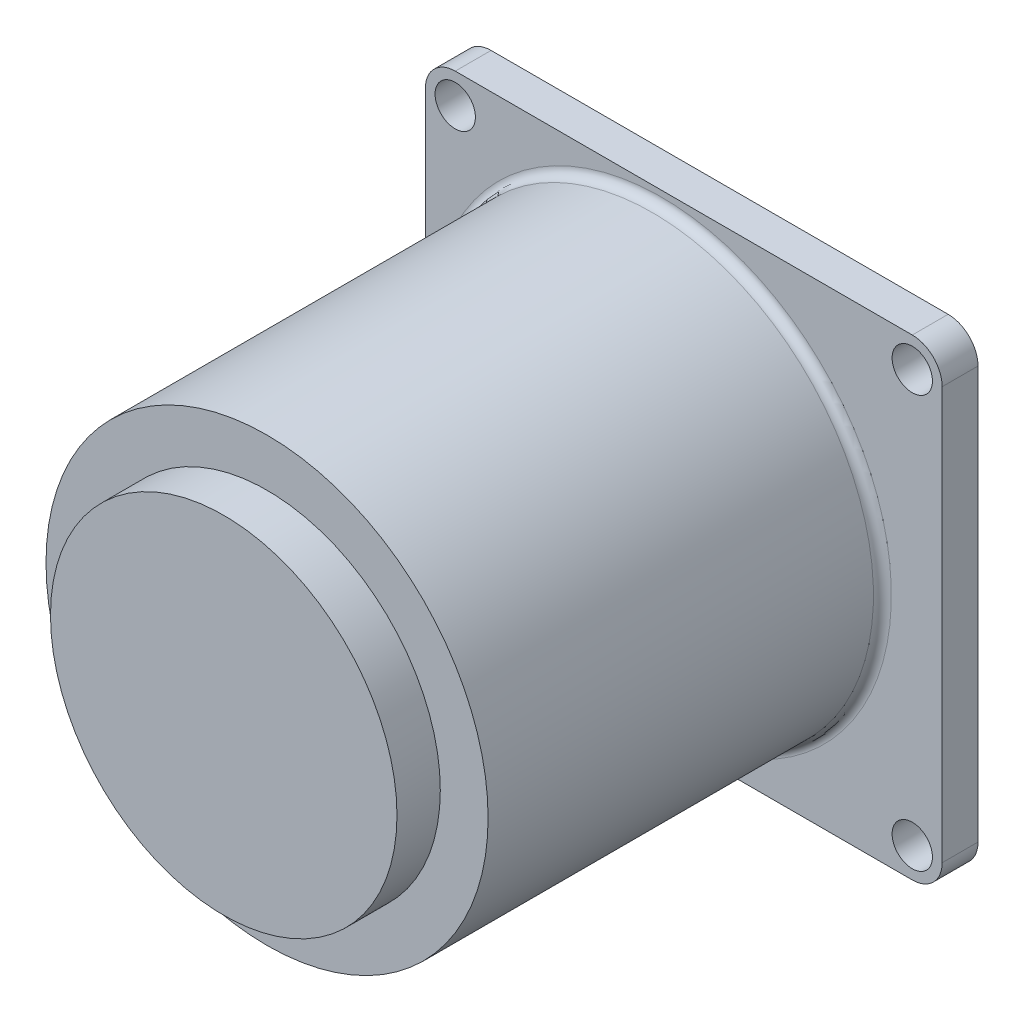
ISO-10303-21;
HEADER;
FILE_DESCRIPTION(('STEP AP214'),'2;1');
FILE_NAME('part.step','',(''),(''),'','','');
FILE_SCHEMA(('AUTOMOTIVE_DESIGN { 1 0 10303 214 1 1 1 1 }'));
ENDSEC;
DATA;
#1=APPLICATION_CONTEXT('core data for automotive mechanical design processes');
#2=APPLICATION_PROTOCOL_DEFINITION('international standard','automotive_design',2000,#1);
#3=PRODUCT_CONTEXT('',#1,'mechanical');
#4=PRODUCT('Part','Part','',(#3));
#5=PRODUCT_RELATED_PRODUCT_CATEGORY('part','',(#4));
#6=PRODUCT_DEFINITION_FORMATION('','',#4);
#7=PRODUCT_DEFINITION_CONTEXT('part definition',#1,'design');
#8=PRODUCT_DEFINITION('design','',#6,#7);
#9=PRODUCT_DEFINITION_SHAPE('','',#8);
#10=(LENGTH_UNIT() NAMED_UNIT(*) SI_UNIT(.MILLI.,.METRE.));
#11=(NAMED_UNIT(*) PLANE_ANGLE_UNIT() SI_UNIT($,.RADIAN.));
#12=(NAMED_UNIT(*) SI_UNIT($,.STERADIAN.) SOLID_ANGLE_UNIT());
#13=UNCERTAINTY_MEASURE_WITH_UNIT(LENGTH_MEASURE(1.E-05),#10,'distance_accuracy_value','');
#14=(GEOMETRIC_REPRESENTATION_CONTEXT(3) GLOBAL_UNCERTAINTY_ASSIGNED_CONTEXT((#13)) GLOBAL_UNIT_ASSIGNED_CONTEXT((#10,
#11,#12)) REPRESENTATION_CONTEXT('',''));
#15=CARTESIAN_POINT('',(0.,0.,0.));
#16=DIRECTION('',(0.,0.,1.));
#17=DIRECTION('',(1.,0.,0.));
#18=AXIS2_PLACEMENT_3D('',#15,#16,#17);
#19=CARTESIAN_POINT('',(0.,0.,24.));
#20=DIRECTION('',(1.,0.,0.));
#21=DIRECTION('',(0.,0.,-1.));
#22=AXIS2_PLACEMENT_3D('',#19,#20,#21);
#23=PLANE('',#22);
#24=DIRECTION('',(0.,-1.,0.));
#25=VECTOR('',#24,1.);
#26=CARTESIAN_POINT('',(0.,0.,0.));
#27=LINE('',#26,#25);
#28=CARTESIAN_POINT('',(0.,296.,0.));
#29=VERTEX_POINT('',#28);
#30=CARTESIAN_POINT('',(0.,20.,0.));
#31=VERTEX_POINT('',#30);
#32=EDGE_CURVE('E135',#29,#31,#27,.T.);
#33=ORIENTED_EDGE('',*,*,#32,.T.);
#34=DIRECTION('',(0.,0.,-1.));
#35=VECTOR('',#34,1.);
#36=CARTESIAN_POINT('',(0.,20.,24.));
#37=LINE('',#36,#35);
#38=CARTESIAN_POINT('',(0.,20.,24.));
#39=VERTEX_POINT('',#38);
#40=EDGE_CURVE('E113',#31,#39,#37,.F.);
#41=ORIENTED_EDGE('',*,*,#40,.T.);
#42=DIRECTION('',(0.,-1.,0.));
#43=VECTOR('',#42,1.);
#44=CARTESIAN_POINT('',(0.,0.,24.));
#45=LINE('',#44,#43);
#46=CARTESIAN_POINT('',(0.,296.,24.));
#47=VERTEX_POINT('',#46);
#48=EDGE_CURVE('E145',#47,#39,#45,.T.);
#49=ORIENTED_EDGE('',*,*,#48,.F.);
#50=DIRECTION('',(0.,0.,-1.));
#51=VECTOR('',#50,1.);
#52=CARTESIAN_POINT('',(0.,296.,24.));
#53=LINE('',#52,#51);
#54=EDGE_CURVE('E118',#47,#29,#53,.T.);
#55=ORIENTED_EDGE('',*,*,#54,.T.);
#56=EDGE_LOOP('',(#33,#41,#49,#55));
#57=FACE_BOUND('',#56,.T.);
#58=ADVANCED_FACE('F41',(#57),#23,.F.);
#59=CARTESIAN_POINT('',(0.,0.,24.));
#60=DIRECTION('',(0.,1.,0.));
#61=DIRECTION('',(0.,0.,1.));
#62=AXIS2_PLACEMENT_3D('',#59,#60,#61);
#63=PLANE('',#62);
#64=DIRECTION('',(1.,0.,0.));
#65=VECTOR('',#64,1.);
#66=CARTESIAN_POINT('',(0.,0.,24.));
#67=LINE('',#66,#65);
#68=CARTESIAN_POINT('',(20.,0.,24.));
#69=VERTEX_POINT('',#68);
#70=CARTESIAN_POINT('',(326.,0.,24.));
#71=VERTEX_POINT('',#70);
#72=EDGE_CURVE('E128',#69,#71,#67,.T.);
#73=ORIENTED_EDGE('',*,*,#72,.F.);
#74=DIRECTION('',(0.,0.,-1.));
#75=VECTOR('',#74,1.);
#76=CARTESIAN_POINT('',(20.,0.,24.));
#77=LINE('',#76,#75);
#78=CARTESIAN_POINT('',(20.,0.,0.));
#79=VERTEX_POINT('',#78);
#80=EDGE_CURVE('E112',#69,#79,#77,.T.);
#81=ORIENTED_EDGE('',*,*,#80,.T.);
#82=DIRECTION('',(1.,0.,0.));
#83=VECTOR('',#82,1.);
#84=CARTESIAN_POINT('',(0.,0.,0.));
#85=LINE('',#84,#83);
#86=CARTESIAN_POINT('',(326.,0.,0.));
#87=VERTEX_POINT('',#86);
#88=EDGE_CURVE('E125',#79,#87,#85,.T.);
#89=ORIENTED_EDGE('',*,*,#88,.T.);
#90=DIRECTION('',(0.,0.,-1.));
#91=VECTOR('',#90,1.);
#92=CARTESIAN_POINT('',(326.,0.,24.));
#93=LINE('',#92,#91);
#94=EDGE_CURVE('E130',#87,#71,#93,.F.);
#95=ORIENTED_EDGE('',*,*,#94,.T.);
#96=EDGE_LOOP('',(#73,#81,#89,#95));
#97=FACE_BOUND('',#96,.T.);
#98=ADVANCED_FACE('F124',(#97),#63,.F.);
#99=CARTESIAN_POINT('',(346.,0.,24.));
#100=DIRECTION('',(-1.,0.,0.));
#101=DIRECTION('',(0.,0.,1.));
#102=AXIS2_PLACEMENT_3D('',#99,#100,#101);
#103=PLANE('',#102);
#104=DIRECTION('',(0.,1.,0.));
#105=VECTOR('',#104,1.);
#106=CARTESIAN_POINT('',(346.,0.,0.));
#107=LINE('',#106,#105);
#108=CARTESIAN_POINT('',(346.,20.,0.));
#109=VERTEX_POINT('',#108);
#110=CARTESIAN_POINT('',(346.,296.,0.));
#111=VERTEX_POINT('',#110);
#112=EDGE_CURVE('E134',#109,#111,#107,.T.);
#113=ORIENTED_EDGE('',*,*,#112,.T.);
#114=DIRECTION('',(0.,0.,-1.));
#115=VECTOR('',#114,1.);
#116=CARTESIAN_POINT('',(346.,296.,24.));
#117=LINE('',#116,#115);
#118=CARTESIAN_POINT('',(346.,296.,24.));
#119=VERTEX_POINT('',#118);
#120=EDGE_CURVE('E169',#111,#119,#117,.F.);
#121=ORIENTED_EDGE('',*,*,#120,.T.);
#122=DIRECTION('',(0.,1.,0.));
#123=VECTOR('',#122,1.);
#124=CARTESIAN_POINT('',(346.,0.,24.));
#125=LINE('',#124,#123);
#126=CARTESIAN_POINT('',(346.,20.,24.));
#127=VERTEX_POINT('',#126);
#128=EDGE_CURVE('E187',#127,#119,#125,.T.);
#129=ORIENTED_EDGE('',*,*,#128,.F.);
#130=DIRECTION('',(0.,0.,-1.));
#131=VECTOR('',#130,1.);
#132=CARTESIAN_POINT('',(346.,20.,24.));
#133=LINE('',#132,#131);
#134=EDGE_CURVE('E166',#127,#109,#133,.T.);
#135=ORIENTED_EDGE('',*,*,#134,.T.);
#136=EDGE_LOOP('',(#113,#121,#129,#135));
#137=FACE_BOUND('',#136,.T.);
#138=ADVANCED_FACE('F202',(#137),#103,.F.);
#139=CARTESIAN_POINT('',(0.,316.,24.));
#140=DIRECTION('',(0.,-1.,0.));
#141=DIRECTION('',(0.,0.,-1.));
#142=AXIS2_PLACEMENT_3D('',#139,#140,#141);
#143=PLANE('',#142);
#144=DIRECTION('',(-1.,0.,0.));
#145=VECTOR('',#144,1.);
#146=CARTESIAN_POINT('',(0.,316.,0.));
#147=LINE('',#146,#145);
#148=CARTESIAN_POINT('',(326.,316.,0.));
#149=VERTEX_POINT('',#148);
#150=CARTESIAN_POINT('',(20.,316.,0.));
#151=VERTEX_POINT('',#150);
#152=EDGE_CURVE('E138',#149,#151,#147,.T.);
#153=ORIENTED_EDGE('',*,*,#152,.T.);
#154=DIRECTION('',(0.,0.,-1.));
#155=VECTOR('',#154,1.);
#156=CARTESIAN_POINT('',(20.,316.,24.));
#157=LINE('',#156,#155);
#158=CARTESIAN_POINT('',(20.,316.,24.));
#159=VERTEX_POINT('',#158);
#160=EDGE_CURVE('E56',#151,#159,#157,.F.);
#161=ORIENTED_EDGE('',*,*,#160,.T.);
#162=DIRECTION('',(-1.,0.,0.));
#163=VECTOR('',#162,1.);
#164=CARTESIAN_POINT('',(0.,316.,24.));
#165=LINE('',#164,#163);
#166=CARTESIAN_POINT('',(326.,316.,24.));
#167=VERTEX_POINT('',#166);
#168=EDGE_CURVE('E146',#167,#159,#165,.T.);
#169=ORIENTED_EDGE('',*,*,#168,.F.);
#170=DIRECTION('',(0.,0.,-1.));
#171=VECTOR('',#170,1.);
#172=CARTESIAN_POINT('',(326.,316.,24.));
#173=LINE('',#172,#171);
#174=EDGE_CURVE('E162',#167,#149,#173,.T.);
#175=ORIENTED_EDGE('',*,*,#174,.T.);
#176=EDGE_LOOP('',(#153,#161,#169,#175));
#177=FACE_BOUND('',#176,.T.);
#178=ADVANCED_FACE('F197',(#177),#143,.F.);
#179=CARTESIAN_POINT('',(0.,0.,24.));
#180=DIRECTION('',(0.,0.,-1.));
#181=DIRECTION('',(-1.,0.,0.));
#182=AXIS2_PLACEMENT_3D('',#179,#180,#181);
#183=PLANE('',#182);
#184=CARTESIAN_POINT('',(158.,158.,24.));
#185=DIRECTION('',(0.,0.,-1.));
#186=DIRECTION('',(-1.,0.,0.));
#187=AXIS2_PLACEMENT_3D('',#184,#185,#186);
#188=CIRCLE('',#187,154.);
#189=CARTESIAN_POINT('',(3.99999999999998,158.,24.));
#190=VERTEX_POINT('',#189);
#191=EDGE_CURVE('E11',#190,#190,#188,.T.);
#192=ORIENTED_EDGE('',*,*,#191,.T.);
#193=EDGE_LOOP('',(#192));
#194=FACE_BOUND('',#193,.T.);
#195=CARTESIAN_POINT('',(326.,20.,24.));
#196=DIRECTION('',(0.,0.,-1.));
#197=DIRECTION('',(-1.,0.,0.));
#198=AXIS2_PLACEMENT_3D('',#195,#196,#197);
#199=CIRCLE('',#198,13.5000000000001);
#200=CARTESIAN_POINT('',(312.5,20.,24.));
#201=VERTEX_POINT('',#200);
#202=EDGE_CURVE('E338',#201,#201,#199,.F.);
#203=ORIENTED_EDGE('',*,*,#202,.F.);
#204=EDGE_LOOP('',(#203));
#205=FACE_BOUND('',#204,.T.);
#206=CARTESIAN_POINT('',(20.,20.,24.));
#207=DIRECTION('',(0.,0.,-1.));
#208=DIRECTION('',(-1.,0.,0.));
#209=AXIS2_PLACEMENT_3D('',#206,#207,#208);
#210=CIRCLE('',#209,13.5);
#211=CARTESIAN_POINT('',(6.50000000000001,20.,24.));
#212=VERTEX_POINT('',#211);
#213=EDGE_CURVE('E342',#212,#212,#210,.F.);
#214=ORIENTED_EDGE('',*,*,#213,.F.);
#215=EDGE_LOOP('',(#214));
#216=FACE_BOUND('',#215,.T.);
#217=CARTESIAN_POINT('',(20.,296.,24.));
#218=DIRECTION('',(0.,0.,-1.));
#219=DIRECTION('',(-1.,0.,0.));
#220=AXIS2_PLACEMENT_3D('',#217,#218,#219);
#221=CIRCLE('',#220,13.5);
#222=CARTESIAN_POINT('',(6.50000000000001,296.,24.));
#223=VERTEX_POINT('',#222);
#224=EDGE_CURVE('E346',#223,#223,#221,.F.);
#225=ORIENTED_EDGE('',*,*,#224,.F.);
#226=EDGE_LOOP('',(#225));
#227=FACE_BOUND('',#226,.T.);
#228=CARTESIAN_POINT('',(326.,296.,24.));
#229=DIRECTION('',(0.,0.,-1.));
#230=DIRECTION('',(-1.,0.,0.));
#231=AXIS2_PLACEMENT_3D('',#228,#229,#230);
#232=CIRCLE('',#231,13.5);
#233=CARTESIAN_POINT('',(312.5,296.,24.));
#234=VERTEX_POINT('',#233);
#235=EDGE_CURVE('E349',#234,#234,#232,.F.);
#236=ORIENTED_EDGE('',*,*,#235,.F.);
#237=EDGE_LOOP('',(#236));
#238=FACE_BOUND('',#237,.T.);
#239=ORIENTED_EDGE('',*,*,#48,.T.);
#240=CARTESIAN_POINT('',(20.,20.,24.));
#241=DIRECTION('',(0.,0.,-1.));
#242=DIRECTION('',(-1.,0.,0.));
#243=AXIS2_PLACEMENT_3D('',#240,#241,#242);
#244=CIRCLE('',#243,20.);
#245=EDGE_CURVE('E160',#39,#69,#244,.F.);
#246=ORIENTED_EDGE('',*,*,#245,.T.);
#247=ORIENTED_EDGE('',*,*,#72,.T.);
#248=CARTESIAN_POINT('',(326.,20.,24.));
#249=DIRECTION('',(0.,0.,-1.));
#250=DIRECTION('',(-1.,0.,0.));
#251=AXIS2_PLACEMENT_3D('',#248,#249,#250);
#252=CIRCLE('',#251,20.);
#253=EDGE_CURVE('E155',#71,#127,#252,.F.);
#254=ORIENTED_EDGE('',*,*,#253,.T.);
#255=ORIENTED_EDGE('',*,*,#128,.T.);
#256=CARTESIAN_POINT('',(326.,296.,24.));
#257=DIRECTION('',(0.,0.,-1.));
#258=DIRECTION('',(-1.,0.,0.));
#259=AXIS2_PLACEMENT_3D('',#256,#257,#258);
#260=CIRCLE('',#259,20.);
#261=EDGE_CURVE('E63',#119,#167,#260,.F.);
#262=ORIENTED_EDGE('',*,*,#261,.T.);
#263=ORIENTED_EDGE('',*,*,#168,.T.);
#264=CARTESIAN_POINT('',(20.,296.,24.));
#265=DIRECTION('',(0.,0.,-1.));
#266=DIRECTION('',(-1.,0.,0.));
#267=AXIS2_PLACEMENT_3D('',#264,#265,#266);
#268=CIRCLE('',#267,20.);
#269=EDGE_CURVE('E158',#159,#47,#268,.F.);
#270=ORIENTED_EDGE('',*,*,#269,.T.);
#271=EDGE_LOOP('',(#239,#246,#247,#254,#255,#262,#263,#270));
#272=FACE_BOUND('',#271,.T.);
#273=ADVANCED_FACE('F189',(#194,#205,#216,#227,#238,#272),#183,.F.);
#274=CARTESIAN_POINT('',(0.,0.,0.));
#275=DIRECTION('',(0.,0.,-1.));
#276=DIRECTION('',(-1.,0.,0.));
#277=AXIS2_PLACEMENT_3D('',#274,#275,#276);
#278=PLANE('',#277);
#279=CARTESIAN_POINT('',(326.,20.,0.));
#280=DIRECTION('',(0.,0.,-1.));
#281=DIRECTION('',(1.,0.,0.));
#282=AXIS2_PLACEMENT_3D('',#279,#280,#281);
#283=CIRCLE('',#282,13.5000000000001);
#284=CARTESIAN_POINT('',(339.5,20.,0.));
#285=VERTEX_POINT('',#284);
#286=EDGE_CURVE('E356',#285,#285,#283,.T.);
#287=ORIENTED_EDGE('',*,*,#286,.F.);
#288=EDGE_LOOP('',(#287));
#289=FACE_BOUND('',#288,.T.);
#290=CARTESIAN_POINT('',(20.,20.,0.));
#291=DIRECTION('',(0.,0.,-1.));
#292=DIRECTION('',(-1.,0.,0.));
#293=AXIS2_PLACEMENT_3D('',#290,#291,#292);
#294=CIRCLE('',#293,13.5);
#295=CARTESIAN_POINT('',(6.50000000000001,20.,0.));
#296=VERTEX_POINT('',#295);
#297=EDGE_CURVE('E360',#296,#296,#294,.T.);
#298=ORIENTED_EDGE('',*,*,#297,.F.);
#299=EDGE_LOOP('',(#298));
#300=FACE_BOUND('',#299,.T.);
#301=CARTESIAN_POINT('',(20.,296.,0.));
#302=DIRECTION('',(0.,0.,-1.));
#303=DIRECTION('',(1.,0.,0.));
#304=AXIS2_PLACEMENT_3D('',#301,#302,#303);
#305=CIRCLE('',#304,13.5);
#306=CARTESIAN_POINT('',(33.5,296.,0.));
#307=VERTEX_POINT('',#306);
#308=EDGE_CURVE('E353',#307,#307,#305,.T.);
#309=ORIENTED_EDGE('',*,*,#308,.F.);
#310=EDGE_LOOP('',(#309));
#311=FACE_BOUND('',#310,.T.);
#312=CARTESIAN_POINT('',(326.,296.,0.));
#313=DIRECTION('',(0.,0.,-1.));
#314=DIRECTION('',(-1.,0.,0.));
#315=AXIS2_PLACEMENT_3D('',#312,#313,#314);
#316=CIRCLE('',#315,13.5);
#317=CARTESIAN_POINT('',(312.5,296.,0.));
#318=VERTEX_POINT('',#317);
#319=EDGE_CURVE('E350',#318,#318,#316,.T.);
#320=ORIENTED_EDGE('',*,*,#319,.F.);
#321=EDGE_LOOP('',(#320));
#322=FACE_BOUND('',#321,.T.);
#323=ORIENTED_EDGE('',*,*,#88,.F.);
#324=CARTESIAN_POINT('',(20.,20.,0.));
#325=DIRECTION('',(0.,0.,-1.));
#326=DIRECTION('',(-1.,0.,0.));
#327=AXIS2_PLACEMENT_3D('',#324,#325,#326);
#328=CIRCLE('',#327,20.);
#329=EDGE_CURVE('E108',#79,#31,#328,.T.);
#330=ORIENTED_EDGE('',*,*,#329,.T.);
#331=ORIENTED_EDGE('',*,*,#32,.F.);
#332=CARTESIAN_POINT('',(20.,296.,0.));
#333=DIRECTION('',(0.,0.,-1.));
#334=DIRECTION('',(-1.,0.,0.));
#335=AXIS2_PLACEMENT_3D('',#332,#333,#334);
#336=CIRCLE('',#335,20.);
#337=EDGE_CURVE('E119',#29,#151,#336,.T.);
#338=ORIENTED_EDGE('',*,*,#337,.T.);
#339=ORIENTED_EDGE('',*,*,#152,.F.);
#340=CARTESIAN_POINT('',(326.,296.,0.));
#341=DIRECTION('',(0.,0.,-1.));
#342=DIRECTION('',(-1.,0.,0.));
#343=AXIS2_PLACEMENT_3D('',#340,#341,#342);
#344=CIRCLE('',#343,20.);
#345=EDGE_CURVE('E149',#149,#111,#344,.T.);
#346=ORIENTED_EDGE('',*,*,#345,.T.);
#347=ORIENTED_EDGE('',*,*,#112,.F.);
#348=CARTESIAN_POINT('',(326.,20.,0.));
#349=DIRECTION('',(0.,0.,-1.));
#350=DIRECTION('',(-1.,0.,0.));
#351=AXIS2_PLACEMENT_3D('',#348,#349,#350);
#352=CIRCLE('',#351,20.);
#353=EDGE_CURVE('E129',#109,#87,#352,.T.);
#354=ORIENTED_EDGE('',*,*,#353,.T.);
#355=EDGE_LOOP('',(#323,#330,#331,#338,#339,#346,#347,#354));
#356=FACE_BOUND('',#355,.T.);
#357=ADVANCED_FACE('F132',(#289,#300,#311,#322,#356),#278,.T.);
#358=CARTESIAN_POINT('',(20.,20.,24.));
#359=DIRECTION('',(0.,0.,-1.));
#360=DIRECTION('',(-1.,0.,0.));
#361=AXIS2_PLACEMENT_3D('',#358,#359,#360);
#362=CYLINDRICAL_SURFACE('',#361,20.);
#363=ORIENTED_EDGE('',*,*,#245,.F.);
#364=ORIENTED_EDGE('',*,*,#40,.F.);
#365=ORIENTED_EDGE('',*,*,#329,.F.);
#366=ORIENTED_EDGE('',*,*,#80,.F.);
#367=EDGE_LOOP('',(#363,#364,#365,#366));
#368=FACE_BOUND('',#367,.T.);
#369=ADVANCED_FACE('F111',(#368),#362,.T.);
#370=CARTESIAN_POINT('',(20.,296.,24.));
#371=DIRECTION('',(0.,0.,-1.));
#372=DIRECTION('',(-1.,0.,0.));
#373=AXIS2_PLACEMENT_3D('',#370,#371,#372);
#374=CYLINDRICAL_SURFACE('',#373,20.);
#375=ORIENTED_EDGE('',*,*,#269,.F.);
#376=ORIENTED_EDGE('',*,*,#160,.F.);
#377=ORIENTED_EDGE('',*,*,#337,.F.);
#378=ORIENTED_EDGE('',*,*,#54,.F.);
#379=EDGE_LOOP('',(#375,#376,#377,#378));
#380=FACE_BOUND('',#379,.T.);
#381=ADVANCED_FACE('F194',(#380),#374,.T.);
#382=CARTESIAN_POINT('',(326.,296.,24.));
#383=DIRECTION('',(0.,0.,-1.));
#384=DIRECTION('',(-1.,0.,0.));
#385=AXIS2_PLACEMENT_3D('',#382,#383,#384);
#386=CYLINDRICAL_SURFACE('',#385,20.);
#387=ORIENTED_EDGE('',*,*,#261,.F.);
#388=ORIENTED_EDGE('',*,*,#120,.F.);
#389=ORIENTED_EDGE('',*,*,#345,.F.);
#390=ORIENTED_EDGE('',*,*,#174,.F.);
#391=EDGE_LOOP('',(#387,#388,#389,#390));
#392=FACE_BOUND('',#391,.T.);
#393=ADVANCED_FACE('F199',(#392),#386,.T.);
#394=CARTESIAN_POINT('',(326.,20.,24.));
#395=DIRECTION('',(0.,0.,-1.));
#396=DIRECTION('',(-1.,0.,0.));
#397=AXIS2_PLACEMENT_3D('',#394,#395,#396);
#398=CYLINDRICAL_SURFACE('',#397,20.);
#399=ORIENTED_EDGE('',*,*,#253,.F.);
#400=ORIENTED_EDGE('',*,*,#94,.F.);
#401=ORIENTED_EDGE('',*,*,#353,.F.);
#402=ORIENTED_EDGE('',*,*,#134,.F.);
#403=EDGE_LOOP('',(#399,#400,#401,#402));
#404=FACE_BOUND('',#403,.T.);
#405=ADVANCED_FACE('F207',(#404),#398,.T.);
#406=CARTESIAN_POINT('',(158.,158.,288.));
#407=DIRECTION('',(0.,0.,-1.));
#408=DIRECTION('',(-1.,0.,0.));
#409=AXIS2_PLACEMENT_3D('',#406,#407,#408);
#410=CYLINDRICAL_SURFACE('',#409,148.);
#411=CARTESIAN_POINT('',(158.,158.,30.));
#412=DIRECTION('',(0.,0.,-1.));
#413=DIRECTION('',(-1.,0.,0.));
#414=AXIS2_PLACEMENT_3D('',#411,#412,#413);
#415=CIRCLE('',#414,148.);
#416=CARTESIAN_POINT('',(9.99999999999998,158.,30.));
#417=VERTEX_POINT('',#416);
#418=EDGE_CURVE('E49',#417,#417,#415,.F.);
#419=ORIENTED_EDGE('',*,*,#418,.T.);
#420=EDGE_LOOP('',(#419));
#421=FACE_BOUND('',#420,.T.);
#422=CARTESIAN_POINT('',(158.,158.,288.));
#423=DIRECTION('',(0.,0.,1.));
#424=DIRECTION('',(1.,0.,0.));
#425=AXIS2_PLACEMENT_3D('',#422,#423,#424);
#426=CIRCLE('',#425,148.);
#427=CARTESIAN_POINT('',(306.,158.,288.));
#428=VERTEX_POINT('',#427);
#429=EDGE_CURVE('E140',#428,#428,#426,.T.);
#430=ORIENTED_EDGE('',*,*,#429,.F.);
#431=EDGE_LOOP('',(#430));
#432=FACE_BOUND('',#431,.T.);
#433=ADVANCED_FACE('F209',(#421,#432),#410,.T.);
#434=CARTESIAN_POINT('',(158.,158.,288.));
#435=DIRECTION('',(0.,0.,1.));
#436=DIRECTION('',(1.,0.,0.));
#437=AXIS2_PLACEMENT_3D('',#434,#435,#436);
#438=PLANE('',#437);
#439=CARTESIAN_POINT('',(158.,158.,288.));
#440=DIRECTION('',(0.,0.,1.));
#441=DIRECTION('',(1.,0.,0.));
#442=AXIS2_PLACEMENT_3D('',#439,#440,#441);
#443=CIRCLE('',#442,116.);
#444=CARTESIAN_POINT('',(42.,158.,288.));
#445=VERTEX_POINT('',#444);
#446=EDGE_CURVE('E170',#445,#445,#443,.T.);
#447=ORIENTED_EDGE('',*,*,#446,.F.);
#448=EDGE_LOOP('',(#447));
#449=FACE_BOUND('',#448,.T.);
#450=ORIENTED_EDGE('',*,*,#429,.T.);
#451=EDGE_LOOP('',(#450));
#452=FACE_BOUND('',#451,.T.);
#453=ADVANCED_FACE('F214',(#449,#452),#438,.T.);
#454=CARTESIAN_POINT('',(158.,158.,317.));
#455=DIRECTION('',(0.,0.,-1.));
#456=DIRECTION('',(-1.,0.,0.));
#457=AXIS2_PLACEMENT_3D('',#454,#455,#456);
#458=CYLINDRICAL_SURFACE('',#457,116.);
#459=CARTESIAN_POINT('',(158.,158.,317.));
#460=DIRECTION('',(0.,0.,1.));
#461=DIRECTION('',(1.,0.,0.));
#462=AXIS2_PLACEMENT_3D('',#459,#460,#461);
#463=CIRCLE('',#462,116.);
#464=CARTESIAN_POINT('',(42.,158.,317.));
#465=VERTEX_POINT('',#464);
#466=EDGE_CURVE('E180',#465,#465,#463,.T.);
#467=CARTESIAN_POINT('',(42.,158.,317.));
#468=CARTESIAN_POINT('',(42.,158.,316.697916666667));
#469=CARTESIAN_POINT('',(42.,158.,316.395833333333));
#470=CARTESIAN_POINT('',(42.,158.,315.791666666667));
#471=CARTESIAN_POINT('',(42.,158.,315.489583333333));
#472=CARTESIAN_POINT('',(42.,158.,314.885416666667));
#473=CARTESIAN_POINT('',(42.,158.,314.583333333333));
#474=CARTESIAN_POINT('',(42.,158.,313.979166666667));
#475=CARTESIAN_POINT('',(42.,158.,313.677083333333));
#476=CARTESIAN_POINT('',(42.,158.,313.072916666667));
#477=CARTESIAN_POINT('',(42.,158.,312.770833333333));
#478=CARTESIAN_POINT('',(42.,158.,312.166666666667));
#479=CARTESIAN_POINT('',(42.,158.,311.864583333333));
#480=CARTESIAN_POINT('',(42.,158.,311.260416666667));
#481=CARTESIAN_POINT('',(42.,158.,310.958333333333));
#482=CARTESIAN_POINT('',(42.,158.,310.354166666667));
#483=CARTESIAN_POINT('',(42.,158.,310.052083333333));
#484=CARTESIAN_POINT('',(42.,158.,309.447916666667));
#485=CARTESIAN_POINT('',(42.,158.,309.145833333333));
#486=CARTESIAN_POINT('',(42.,158.,308.541666666667));
#487=CARTESIAN_POINT('',(42.,158.,308.239583333333));
#488=CARTESIAN_POINT('',(42.,158.,307.635416666667));
#489=CARTESIAN_POINT('',(42.,158.,307.333333333333));
#490=CARTESIAN_POINT('',(42.,158.,306.729166666667));
#491=CARTESIAN_POINT('',(42.,158.,306.427083333333));
#492=CARTESIAN_POINT('',(42.,158.,305.822916666667));
#493=CARTESIAN_POINT('',(42.,158.,305.520833333333));
#494=CARTESIAN_POINT('',(42.,158.,304.916666666667));
#495=CARTESIAN_POINT('',(42.,158.,304.614583333333));
#496=CARTESIAN_POINT('',(42.,158.,304.010416666667));
#497=CARTESIAN_POINT('',(42.,158.,303.708333333333));
#498=CARTESIAN_POINT('',(42.,158.,303.104166666667));
#499=CARTESIAN_POINT('',(42.,158.,302.802083333333));
#500=CARTESIAN_POINT('',(42.,158.,302.197916666667));
#501=CARTESIAN_POINT('',(42.,158.,301.895833333333));
#502=CARTESIAN_POINT('',(42.,158.,301.291666666667));
#503=CARTESIAN_POINT('',(42.,158.,300.989583333333));
#504=CARTESIAN_POINT('',(42.,158.,300.385416666667));
#505=CARTESIAN_POINT('',(42.,158.,300.083333333333));
#506=CARTESIAN_POINT('',(42.,158.,299.479166666667));
#507=CARTESIAN_POINT('',(42.,158.,299.177083333333));
#508=CARTESIAN_POINT('',(42.,158.,298.572916666667));
#509=CARTESIAN_POINT('',(42.,158.,298.270833333333));
#510=CARTESIAN_POINT('',(42.,158.,297.666666666667));
#511=CARTESIAN_POINT('',(42.,158.,297.364583333333));
#512=CARTESIAN_POINT('',(42.,158.,296.760416666667));
#513=CARTESIAN_POINT('',(42.,158.,296.458333333333));
#514=CARTESIAN_POINT('',(42.,158.,295.854166666667));
#515=CARTESIAN_POINT('',(42.,158.,295.552083333333));
#516=CARTESIAN_POINT('',(42.,158.,294.947916666667));
#517=CARTESIAN_POINT('',(42.,158.,294.645833333333));
#518=CARTESIAN_POINT('',(42.,158.,294.041666666667));
#519=CARTESIAN_POINT('',(42.,158.,293.739583333333));
#520=CARTESIAN_POINT('',(42.,158.,293.135416666667));
#521=CARTESIAN_POINT('',(42.,158.,292.833333333333));
#522=CARTESIAN_POINT('',(42.,158.,292.229166666667));
#523=CARTESIAN_POINT('',(42.,158.,291.927083333333));
#524=CARTESIAN_POINT('',(42.,158.,291.322916666667));
#525=CARTESIAN_POINT('',(42.,158.,291.020833333333));
#526=CARTESIAN_POINT('',(42.,158.,290.416666666667));
#527=CARTESIAN_POINT('',(42.,158.,290.114583333333));
#528=CARTESIAN_POINT('',(42.,158.,289.510416666667));
#529=CARTESIAN_POINT('',(42.,158.,289.208333333333));
#530=CARTESIAN_POINT('',(42.,158.,288.604166666667));
#531=CARTESIAN_POINT('',(42.,158.,288.302083333333));
#532=CARTESIAN_POINT('',(42.,158.,288.));
#533=B_SPLINE_CURVE_WITH_KNOTS('',3,(#467,#468,#469,#470,#471,#472,#473,#474,#475,#476,#477,
#478,#479,#480,#481,#482,#483,#484,#485,#486,#487,#488,#489,#490,#491,#492,#493,#494,#495,#496,
#497,#498,#499,#500,#501,#502,#503,#504,#505,#506,#507,#508,#509,#510,#511,#512,#513,#514,#515,
#516,#517,#518,#519,#520,#521,#522,#523,#524,#525,#526,#527,#528,#529,#530,#531,#532),
.UNSPECIFIED.,.F.,.F.,(4,2,2,2,2,2,2,2,2,2,2,2,2,2,2,2,2,2,2,2,2,2,2,2,2,2,2,2,2,2,2,2,4),(0.,
0.906249999999997,1.81249999999999,2.71874999999999,3.62499999999999,4.53124999999999,
5.43749999999998,6.34374999999998,7.24999999999998,8.15624999999998,9.06249999999997,
9.96874999999997,10.875,11.78125,12.6875,13.59375,14.5,15.40625,16.3125,17.21875,18.125,
19.03125,19.9375,20.84375,21.75,22.65625,23.5625,24.46875,25.375,26.28125,27.1875,28.09375,29.),.UNSPECIFIED.);
#534=EDGE_CURVE('BSEAM258',#465,#445,#533,.T.);
#535=ORIENTED_EDGE('',*,*,#466,.F.);
#536=ORIENTED_EDGE('',*,*,#446,.T.);
#537=ORIENTED_EDGE('',*,*,#534,.T.);
#538=ORIENTED_EDGE('',*,*,#534,.F.);
#539=EDGE_LOOP('',(#535,#537,#536,#538));
#540=FACE_BOUND('',#539,.T.);
#541=ADVANCED_FACE('F258',(#540),#458,.T.);
#542=CARTESIAN_POINT('',(158.,158.,317.));
#543=DIRECTION('',(0.,0.,1.));
#544=DIRECTION('',(1.,0.,0.));
#545=AXIS2_PLACEMENT_3D('',#542,#543,#544);
#546=PLANE('',#545);
#547=ORIENTED_EDGE('',*,*,#466,.T.);
#548=EDGE_LOOP('',(#547));
#549=FACE_BOUND('',#548,.T.);
#550=ADVANCED_FACE('F268',(#549),#546,.T.);
#551=CARTESIAN_POINT('',(326.,296.,62.1837661840737));
#552=DIRECTION('',(0.,0.,-1.));
#553=DIRECTION('',(-1.,0.,0.));
#554=AXIS2_PLACEMENT_3D('',#551,#552,#553);
#555=CYLINDRICAL_SURFACE('',#554,13.5);
#556=ORIENTED_EDGE('',*,*,#235,.T.);
#557=EDGE_LOOP('',(#556));
#558=FACE_BOUND('',#557,.T.);
#559=ORIENTED_EDGE('',*,*,#319,.T.);
#560=EDGE_LOOP('',(#559));
#561=FACE_BOUND('',#560,.T.);
#562=ADVANCED_FACE('F278',(#558,#561),#555,.F.);
#563=CARTESIAN_POINT('',(20.,296.,62.1837661840737));
#564=DIRECTION('',(0.,0.,-1.));
#565=DIRECTION('',(-1.,0.,0.));
#566=AXIS2_PLACEMENT_3D('',#563,#564,#565);
#567=CYLINDRICAL_SURFACE('',#566,13.5);
#568=ORIENTED_EDGE('',*,*,#224,.T.);
#569=EDGE_LOOP('',(#568));
#570=FACE_BOUND('',#569,.T.);
#571=ORIENTED_EDGE('',*,*,#308,.T.);
#572=EDGE_LOOP('',(#571));
#573=FACE_BOUND('',#572,.T.);
#574=ADVANCED_FACE('F288',(#570,#573),#567,.F.);
#575=CARTESIAN_POINT('',(20.,20.,62.1837661840737));
#576=DIRECTION('',(0.,0.,-1.));
#577=DIRECTION('',(-1.,0.,0.));
#578=AXIS2_PLACEMENT_3D('',#575,#576,#577);
#579=CYLINDRICAL_SURFACE('',#578,13.5);
#580=ORIENTED_EDGE('',*,*,#213,.T.);
#581=EDGE_LOOP('',(#580));
#582=FACE_BOUND('',#581,.T.);
#583=ORIENTED_EDGE('',*,*,#297,.T.);
#584=EDGE_LOOP('',(#583));
#585=FACE_BOUND('',#584,.T.);
#586=ADVANCED_FACE('F298',(#582,#585),#579,.F.);
#587=CARTESIAN_POINT('',(326.,20.,62.1837661840737));
#588=DIRECTION('',(0.,0.,-1.));
#589=DIRECTION('',(-1.,0.,0.));
#590=AXIS2_PLACEMENT_3D('',#587,#588,#589);
#591=CYLINDRICAL_SURFACE('',#590,13.5000000000001);
#592=ORIENTED_EDGE('',*,*,#202,.T.);
#593=EDGE_LOOP('',(#592));
#594=FACE_BOUND('',#593,.T.);
#595=ORIENTED_EDGE('',*,*,#286,.T.);
#596=EDGE_LOOP('',(#595));
#597=FACE_BOUND('',#596,.T.);
#598=ADVANCED_FACE('F308',(#594,#597),#591,.F.);
#599=CARTESIAN_POINT('',(158.,158.,30.));
#600=DIRECTION('',(0.,0.,-1.));
#601=DIRECTION('',(-1.,0.,0.));
#602=AXIS2_PLACEMENT_3D('',#599,#600,#601);
#603=TOROIDAL_SURFACE('',#602,154.,6.);
#604=ORIENTED_EDGE('',*,*,#191,.F.);
#605=EDGE_LOOP('',(#604));
#606=FACE_BOUND('',#605,.T.);
#607=ORIENTED_EDGE('',*,*,#418,.F.);
#608=EDGE_LOOP('',(#607));
#609=FACE_BOUND('',#608,.T.);
#610=ADVANCED_FACE('F43',(#606,#609),#603,.F.);
#611=CLOSED_SHELL('',(#58,#98,#138,#178,#273,#357,#369,#381,#393,#405,#433,#453,#541,#550,#562,
#574,#586,#598,#610));
#612=MANIFOLD_SOLID_BREP('B2',#611);
#613=ADVANCED_BREP_SHAPE_REPRESENTATION('',(#18,#612),#14);
#614=SHAPE_DEFINITION_REPRESENTATION(#9,#613);
ENDSEC;
END-ISO-10303-21;
